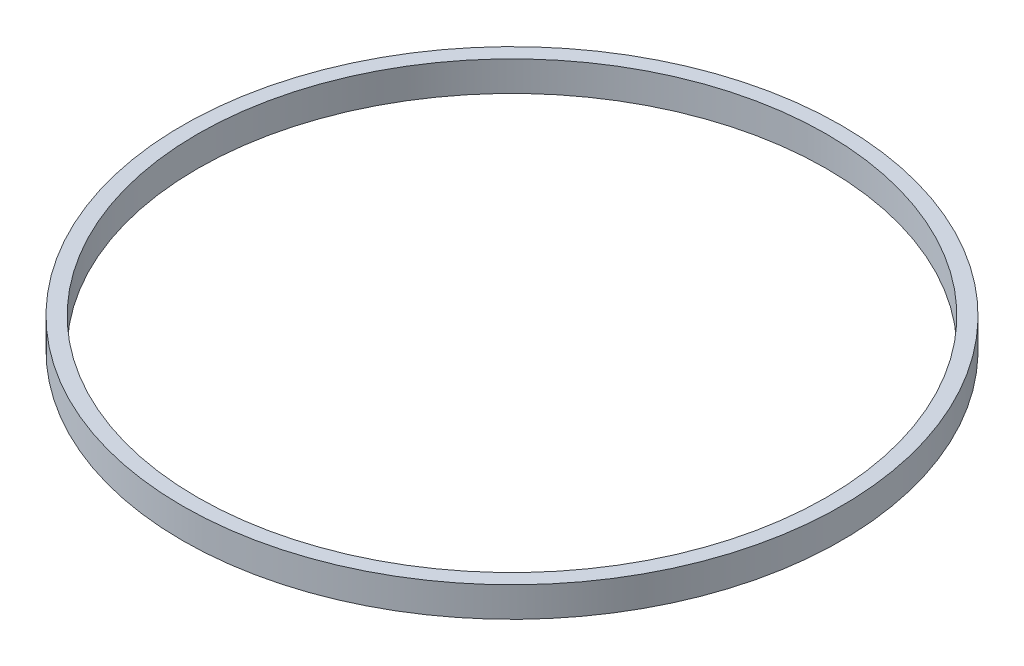
ISO-10303-21;
HEADER;
FILE_DESCRIPTION(('STEP AP214'),'2;1');
FILE_NAME('part.step','',(''),(''),'','','');
FILE_SCHEMA(('AUTOMOTIVE_DESIGN { 1 0 10303 214 1 1 1 1 }'));
ENDSEC;
DATA;
#1=APPLICATION_CONTEXT('core data for automotive mechanical design processes');
#2=APPLICATION_PROTOCOL_DEFINITION('international standard','automotive_design',2000,#1);
#3=PRODUCT_CONTEXT('',#1,'mechanical');
#4=PRODUCT('Part','Part','',(#3));
#5=PRODUCT_RELATED_PRODUCT_CATEGORY('part','',(#4));
#6=PRODUCT_DEFINITION_FORMATION('','',#4);
#7=PRODUCT_DEFINITION_CONTEXT('part definition',#1,'design');
#8=PRODUCT_DEFINITION('design','',#6,#7);
#9=PRODUCT_DEFINITION_SHAPE('','',#8);
#10=(LENGTH_UNIT() NAMED_UNIT(*) SI_UNIT(.MILLI.,.METRE.));
#11=(NAMED_UNIT(*) PLANE_ANGLE_UNIT() SI_UNIT($,.RADIAN.));
#12=(NAMED_UNIT(*) SI_UNIT($,.STERADIAN.) SOLID_ANGLE_UNIT());
#13=UNCERTAINTY_MEASURE_WITH_UNIT(LENGTH_MEASURE(1.E-05),#10,'distance_accuracy_value','');
#14=(GEOMETRIC_REPRESENTATION_CONTEXT(3) GLOBAL_UNCERTAINTY_ASSIGNED_CONTEXT((#13)) GLOBAL_UNIT_ASSIGNED_CONTEXT((#10,
#11,#12)) REPRESENTATION_CONTEXT('',''));
#15=CARTESIAN_POINT('',(0.,0.,0.));
#16=DIRECTION('',(0.,0.,1.));
#17=DIRECTION('',(1.,0.,0.));
#18=AXIS2_PLACEMENT_3D('',#15,#16,#17);
#19=CARTESIAN_POINT('',(0.,3.,0.));
#20=DIRECTION('',(0.,1.,0.));
#21=DIRECTION('',(0.,0.,1.));
#22=AXIS2_PLACEMENT_3D('',#19,#20,#21);
#23=PLANE('',#22);
#24=CARTESIAN_POINT('',(0.,3.,0.));
#25=DIRECTION('',(0.,1.,0.));
#26=DIRECTION('',(0.,0.,1.));
#27=AXIS2_PLACEMENT_3D('',#24,#25,#26);
#28=CIRCLE('',#27,33.);
#29=CARTESIAN_POINT('',(0.,3.,33.));
#30=VERTEX_POINT('',#29);
#31=EDGE_CURVE('E10',#30,#30,#28,.T.);
#32=ORIENTED_EDGE('',*,*,#31,.T.);
#33=EDGE_LOOP('',(#32));
#34=FACE_BOUND('',#33,.T.);
#35=CARTESIAN_POINT('',(0.,3.,0.));
#36=DIRECTION('',(0.,1.,0.));
#37=DIRECTION('',(0.,0.,1.));
#38=AXIS2_PLACEMENT_3D('',#35,#36,#37);
#39=CIRCLE('',#38,31.5);
#40=CARTESIAN_POINT('',(0.,3.,31.5));
#41=VERTEX_POINT('',#40);
#42=EDGE_CURVE('E43',#41,#41,#39,.T.);
#43=ORIENTED_EDGE('',*,*,#42,.F.);
#44=EDGE_LOOP('',(#43));
#45=FACE_BOUND('',#44,.T.);
#46=ADVANCED_FACE('F32',(#34,#45),#23,.T.);
#47=CARTESIAN_POINT('',(0.,0.,0.));
#48=DIRECTION('',(0.,1.,0.));
#49=DIRECTION('',(0.,0.,1.));
#50=AXIS2_PLACEMENT_3D('',#47,#48,#49);
#51=PLANE('',#50);
#52=CARTESIAN_POINT('',(0.,0.,0.));
#53=DIRECTION('',(0.,1.,0.));
#54=DIRECTION('',(0.,0.,1.));
#55=AXIS2_PLACEMENT_3D('',#52,#53,#54);
#56=CIRCLE('',#55,33.);
#57=CARTESIAN_POINT('',(0.,0.,33.));
#58=VERTEX_POINT('',#57);
#59=EDGE_CURVE('E36',#58,#58,#56,.T.);
#60=ORIENTED_EDGE('',*,*,#59,.F.);
#61=EDGE_LOOP('',(#60));
#62=FACE_BOUND('',#61,.T.);
#63=CARTESIAN_POINT('',(0.,0.,0.));
#64=DIRECTION('',(0.,1.,0.));
#65=DIRECTION('',(0.,0.,1.));
#66=AXIS2_PLACEMENT_3D('',#63,#64,#65);
#67=CIRCLE('',#66,31.5);
#68=CARTESIAN_POINT('',(0.,0.,31.5));
#69=VERTEX_POINT('',#68);
#70=EDGE_CURVE('E45',#69,#69,#67,.T.);
#71=ORIENTED_EDGE('',*,*,#70,.T.);
#72=EDGE_LOOP('',(#71));
#73=FACE_BOUND('',#72,.T.);
#74=ADVANCED_FACE('F55',(#62,#73),#51,.F.);
#75=CARTESIAN_POINT('',(0.,3.,0.));
#76=DIRECTION('',(0.,-1.,0.));
#77=DIRECTION('',(0.,0.,-1.));
#78=AXIS2_PLACEMENT_3D('',#75,#76,#77);
#79=CYLINDRICAL_SURFACE('',#78,33.);
#80=ORIENTED_EDGE('',*,*,#31,.F.);
#81=EDGE_LOOP('',(#80));
#82=FACE_BOUND('',#81,.T.);
#83=ORIENTED_EDGE('',*,*,#59,.T.);
#84=EDGE_LOOP('',(#83));
#85=FACE_BOUND('',#84,.T.);
#86=ADVANCED_FACE('F34',(#82,#85),#79,.T.);
#87=CARTESIAN_POINT('',(0.,3.,0.));
#88=DIRECTION('',(0.,-1.,0.));
#89=DIRECTION('',(0.,0.,-1.));
#90=AXIS2_PLACEMENT_3D('',#87,#88,#89);
#91=CYLINDRICAL_SURFACE('',#90,31.5);
#92=ORIENTED_EDGE('',*,*,#42,.T.);
#93=EDGE_LOOP('',(#92));
#94=FACE_BOUND('',#93,.T.);
#95=ORIENTED_EDGE('',*,*,#70,.F.);
#96=EDGE_LOOP('',(#95));
#97=FACE_BOUND('',#96,.T.);
#98=ADVANCED_FACE('F51',(#94,#97),#91,.F.);
#99=CLOSED_SHELL('',(#46,#74,#86,#98));
#100=MANIFOLD_SOLID_BREP('B2',#99);
#101=ADVANCED_BREP_SHAPE_REPRESENTATION('',(#18,#100),#14);
#102=SHAPE_DEFINITION_REPRESENTATION(#9,#101);
ENDSEC;
END-ISO-10303-21;
